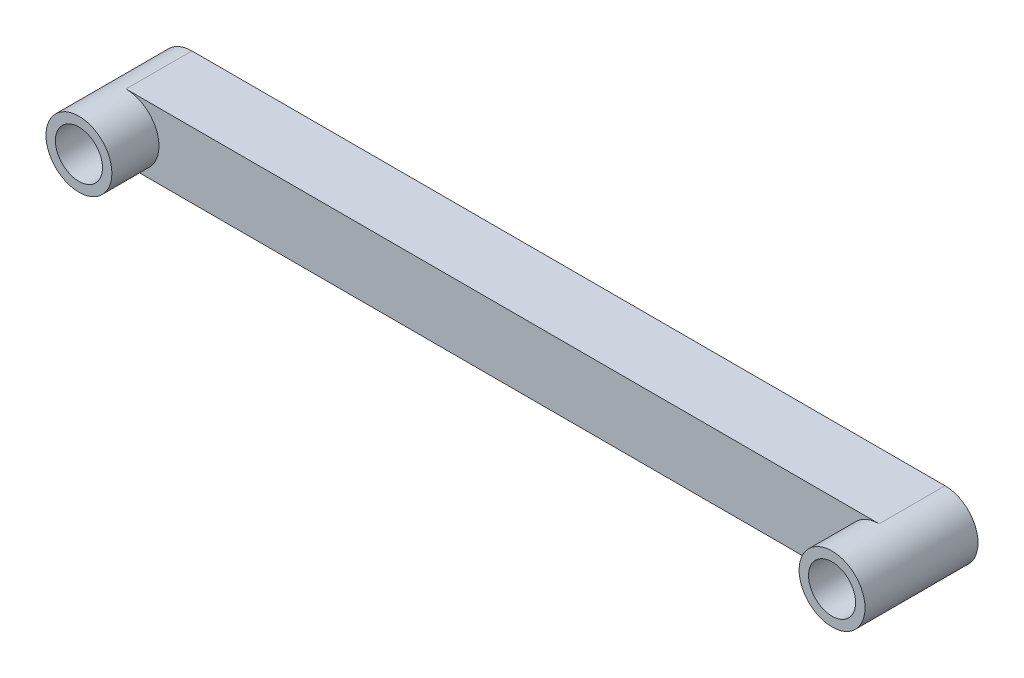
ISO-10303-21;
HEADER;
FILE_DESCRIPTION(('STEP AP214'),'2;1');
FILE_NAME('part.step','',(''),(''),'','','');
FILE_SCHEMA(('AUTOMOTIVE_DESIGN { 1 0 10303 214 1 1 1 1 }'));
ENDSEC;
DATA;
#1=APPLICATION_CONTEXT('core data for automotive mechanical design processes');
#2=APPLICATION_PROTOCOL_DEFINITION('international standard','automotive_design',2000,#1);
#3=PRODUCT_CONTEXT('',#1,'mechanical');
#4=PRODUCT('Part','Part','',(#3));
#5=PRODUCT_RELATED_PRODUCT_CATEGORY('part','',(#4));
#6=PRODUCT_DEFINITION_FORMATION('','',#4);
#7=PRODUCT_DEFINITION_CONTEXT('part definition',#1,'design');
#8=PRODUCT_DEFINITION('design','',#6,#7);
#9=PRODUCT_DEFINITION_SHAPE('','',#8);
#10=(LENGTH_UNIT() NAMED_UNIT(*) SI_UNIT(.MILLI.,.METRE.));
#11=(NAMED_UNIT(*) PLANE_ANGLE_UNIT() SI_UNIT($,.RADIAN.));
#12=(NAMED_UNIT(*) SI_UNIT($,.STERADIAN.) SOLID_ANGLE_UNIT());
#13=UNCERTAINTY_MEASURE_WITH_UNIT(LENGTH_MEASURE(1.E-05),#10,'distance_accuracy_value','');
#14=(GEOMETRIC_REPRESENTATION_CONTEXT(3) GLOBAL_UNCERTAINTY_ASSIGNED_CONTEXT((#13)) GLOBAL_UNIT_ASSIGNED_CONTEXT((#10,
#11,#12)) REPRESENTATION_CONTEXT('',''));
#15=CARTESIAN_POINT('',(0.,0.,0.));
#16=DIRECTION('',(0.,0.,1.));
#17=DIRECTION('',(1.,0.,0.));
#18=AXIS2_PLACEMENT_3D('',#15,#16,#17);
#19=CARTESIAN_POINT('',(-46.5928639082978,0.,14.));
#20=DIRECTION('',(0.,0.,-1.));
#21=DIRECTION('',(-1.,0.,0.));
#22=AXIS2_PLACEMENT_3D('',#19,#20,#21);
#23=CYLINDRICAL_SURFACE('',#22,7.);
#24=CARTESIAN_POINT('',(-46.5928639082978,0.,14.));
#25=DIRECTION('',(0.,0.,1.));
#26=DIRECTION('',(1.,0.,0.));
#27=AXIS2_PLACEMENT_3D('',#24,#25,#26);
#28=CIRCLE('',#27,7.);
#29=CARTESIAN_POINT('',(-39.5928639082978,0.,14.));
#30=VERTEX_POINT('',#29);
#31=EDGE_CURVE('E174',#30,#30,#28,.T.);
#32=ORIENTED_EDGE('',*,*,#31,.F.);
#33=EDGE_LOOP('',(#32));
#34=FACE_BOUND('',#33,.T.);
#35=DIRECTION('',(0.,0.,-1.));
#36=VECTOR('',#35,1.);
#37=CARTESIAN_POINT('',(-46.5928639082978,-7.,4.));
#38=LINE('',#37,#36);
#39=CARTESIAN_POINT('',(-46.5928639082978,-7.,4.));
#40=VERTEX_POINT('',#39);
#41=CARTESIAN_POINT('',(-46.5928639082978,-7.,-10.));
#42=VERTEX_POINT('',#41);
#43=EDGE_CURVE('E98',#40,#42,#38,.T.);
#44=ORIENTED_EDGE('',*,*,#43,.F.);
#45=CARTESIAN_POINT('',(-46.5928639082978,0.,4.));
#46=DIRECTION('',(0.,0.,1.));
#47=DIRECTION('',(1.,0.,0.));
#48=AXIS2_PLACEMENT_3D('',#45,#46,#47);
#49=CIRCLE('',#48,7.);
#50=CARTESIAN_POINT('',(-46.5928639082978,7.,4.));
#51=VERTEX_POINT('',#50);
#52=EDGE_CURVE('E93',#40,#51,#49,.T.);
#53=ORIENTED_EDGE('',*,*,#52,.T.);
#54=DIRECTION('',(0.,0.,-1.));
#55=VECTOR('',#54,1.);
#56=CARTESIAN_POINT('',(-46.5928639082978,7.,4.));
#57=LINE('',#56,#55);
#58=CARTESIAN_POINT('',(-46.5928639082978,7.,-10.));
#59=VERTEX_POINT('',#58);
#60=EDGE_CURVE('E115',#51,#59,#57,.T.);
#61=ORIENTED_EDGE('',*,*,#60,.T.);
#62=CARTESIAN_POINT('',(-46.5928639082978,0.,-10.));
#63=DIRECTION('',(0.,0.,-1.));
#64=DIRECTION('',(-1.,0.,0.));
#65=AXIS2_PLACEMENT_3D('',#62,#63,#64);
#66=CIRCLE('',#65,7.);
#67=EDGE_CURVE('E118',#42,#59,#66,.T.);
#68=ORIENTED_EDGE('',*,*,#67,.F.);
#69=EDGE_LOOP('',(#44,#53,#61,#68));
#70=FACE_BOUND('',#69,.T.);
#71=ADVANCED_FACE('F77',(#34,#70),#23,.T.);
#72=CARTESIAN_POINT('',(0.,0.,4.));
#73=DIRECTION('',(0.,0.,1.));
#74=DIRECTION('',(1.,0.,0.));
#75=AXIS2_PLACEMENT_3D('',#72,#73,#74);
#76=PLANE('',#75);
#77=CARTESIAN_POINT('',(-46.5928639082978,0.,4.));
#78=DIRECTION('',(0.,0.,1.));
#79=DIRECTION('',(1.,0.,0.));
#80=AXIS2_PLACEMENT_3D('',#77,#78,#79);
#81=CIRCLE('',#80,5.);
#82=CARTESIAN_POINT('',(-41.5928639082978,0.,4.));
#83=VERTEX_POINT('',#82);
#84=EDGE_CURVE('E86',#83,#83,#81,.F.);
#85=ORIENTED_EDGE('',*,*,#84,.F.);
#86=EDGE_LOOP('',(#85));
#87=FACE_BOUND('',#86,.T.);
#88=ADVANCED_FACE('F79',(#87),#76,.T.);
#89=CARTESIAN_POINT('',(-46.5928639082978,0.,14.));
#90=DIRECTION('',(0.,0.,-1.));
#91=DIRECTION('',(-1.,0.,0.));
#92=AXIS2_PLACEMENT_3D('',#89,#90,#91);
#93=CYLINDRICAL_SURFACE('',#92,5.);
#94=ORIENTED_EDGE('',*,*,#84,.T.);
#95=EDGE_LOOP('',(#94));
#96=FACE_BOUND('',#95,.T.);
#97=CARTESIAN_POINT('',(-46.5928639082978,0.,14.));
#98=DIRECTION('',(0.,0.,1.));
#99=DIRECTION('',(1.,0.,0.));
#100=AXIS2_PLACEMENT_3D('',#97,#98,#99);
#101=CIRCLE('',#100,5.);
#102=CARTESIAN_POINT('',(-41.5928639082978,0.,14.));
#103=VERTEX_POINT('',#102);
#104=EDGE_CURVE('E178',#103,#103,#101,.T.);
#105=ORIENTED_EDGE('',*,*,#104,.T.);
#106=EDGE_LOOP('',(#105));
#107=FACE_BOUND('',#106,.T.);
#108=ADVANCED_FACE('F185',(#96,#107),#93,.F.);
#109=CARTESIAN_POINT('',(0.,0.,14.));
#110=DIRECTION('',(0.,0.,1.));
#111=DIRECTION('',(1.,0.,0.));
#112=AXIS2_PLACEMENT_3D('',#109,#110,#111);
#113=PLANE('',#112);
#114=ORIENTED_EDGE('',*,*,#31,.T.);
#115=EDGE_LOOP('',(#114));
#116=FACE_BOUND('',#115,.T.);
#117=ORIENTED_EDGE('',*,*,#104,.F.);
#118=EDGE_LOOP('',(#117));
#119=FACE_BOUND('',#118,.T.);
#120=ADVANCED_FACE('F192',(#116,#119),#113,.T.);
#121=CARTESIAN_POINT('',(0.,-7.,4.));
#122=DIRECTION('',(0.,1.,0.));
#123=DIRECTION('',(0.,0.,1.));
#124=AXIS2_PLACEMENT_3D('',#121,#122,#123);
#125=PLANE('',#124);
#126=ORIENTED_EDGE('',*,*,#43,.T.);
#127=DIRECTION('',(-1.,0.,0.));
#128=VECTOR('',#127,1.);
#129=CARTESIAN_POINT('',(113.407136091702,-7.,-10.));
#130=LINE('',#129,#128);
#131=CARTESIAN_POINT('',(113.407136091702,-7.,-10.));
#132=VERTEX_POINT('',#131);
#133=EDGE_CURVE('E139',#132,#42,#130,.T.);
#134=ORIENTED_EDGE('',*,*,#133,.F.);
#135=DIRECTION('',(0.,0.,-1.));
#136=VECTOR('',#135,1.);
#137=CARTESIAN_POINT('',(113.407136091702,-7.,4.));
#138=LINE('',#137,#136);
#139=CARTESIAN_POINT('',(113.407136091702,-7.,4.));
#140=VERTEX_POINT('',#139);
#141=EDGE_CURVE('E169',#140,#132,#138,.T.);
#142=ORIENTED_EDGE('',*,*,#141,.F.);
#143=DIRECTION('',(1.,0.,0.));
#144=VECTOR('',#143,1.);
#145=CARTESIAN_POINT('',(0.,-7.,4.));
#146=LINE('',#145,#144);
#147=EDGE_CURVE('E157',#40,#140,#146,.T.);
#148=ORIENTED_EDGE('',*,*,#147,.F.);
#149=EDGE_LOOP('',(#126,#134,#142,#148));
#150=FACE_BOUND('',#149,.T.);
#151=ADVANCED_FACE('F204',(#150),#125,.F.);
#152=CARTESIAN_POINT('',(0.,7.,4.));
#153=DIRECTION('',(0.,1.,0.));
#154=DIRECTION('',(0.,0.,1.));
#155=AXIS2_PLACEMENT_3D('',#152,#153,#154);
#156=PLANE('',#155);
#157=DIRECTION('',(0.,0.,-1.));
#158=VECTOR('',#157,1.);
#159=CARTESIAN_POINT('',(113.407136091702,7.,4.));
#160=LINE('',#159,#158);
#161=CARTESIAN_POINT('',(113.407136091702,7.,4.));
#162=VERTEX_POINT('',#161);
#163=CARTESIAN_POINT('',(113.407136091702,7.,-10.));
#164=VERTEX_POINT('',#163);
#165=EDGE_CURVE('E123',#162,#164,#160,.T.);
#166=ORIENTED_EDGE('',*,*,#165,.T.);
#167=DIRECTION('',(1.,0.,0.));
#168=VECTOR('',#167,1.);
#169=CARTESIAN_POINT('',(-46.5928639082978,7.,-10.));
#170=LINE('',#169,#168);
#171=EDGE_CURVE('E127',#59,#164,#170,.T.);
#172=ORIENTED_EDGE('',*,*,#171,.F.);
#173=ORIENTED_EDGE('',*,*,#60,.F.);
#174=DIRECTION('',(1.,0.,0.));
#175=VECTOR('',#174,1.);
#176=CARTESIAN_POINT('',(0.,7.,4.));
#177=LINE('',#176,#175);
#178=EDGE_CURVE('E124',#51,#162,#177,.T.);
#179=ORIENTED_EDGE('',*,*,#178,.T.);
#180=EDGE_LOOP('',(#166,#172,#173,#179));
#181=FACE_BOUND('',#180,.T.);
#182=ADVANCED_FACE('F128',(#181),#156,.T.);
#183=CARTESIAN_POINT('',(0.,0.,4.));
#184=DIRECTION('',(0.,0.,1.));
#185=DIRECTION('',(1.,0.,0.));
#186=AXIS2_PLACEMENT_3D('',#183,#184,#185);
#187=PLANE('',#186);
#188=ORIENTED_EDGE('',*,*,#52,.F.);
#189=ORIENTED_EDGE('',*,*,#147,.T.);
#190=CARTESIAN_POINT('',(113.407136091702,0.,4.));
#191=DIRECTION('',(0.,0.,1.));
#192=DIRECTION('',(1.,0.,0.));
#193=AXIS2_PLACEMENT_3D('',#190,#191,#192);
#194=CIRCLE('',#193,7.);
#195=EDGE_CURVE('E161',#162,#140,#194,.T.);
#196=ORIENTED_EDGE('',*,*,#195,.F.);
#197=ORIENTED_EDGE('',*,*,#178,.F.);
#198=EDGE_LOOP('',(#188,#189,#196,#197));
#199=FACE_BOUND('',#198,.T.);
#200=ADVANCED_FACE('F210',(#199),#187,.T.);
#201=CARTESIAN_POINT('',(113.407136091702,0.,14.));
#202=DIRECTION('',(0.,0.,-1.));
#203=DIRECTION('',(-1.,0.,0.));
#204=AXIS2_PLACEMENT_3D('',#201,#202,#203);
#205=CYLINDRICAL_SURFACE('',#204,5.);
#206=CARTESIAN_POINT('',(113.407136091702,0.,4.));
#207=DIRECTION('',(0.,0.,1.));
#208=DIRECTION('',(1.,0.,0.));
#209=AXIS2_PLACEMENT_3D('',#206,#207,#208);
#210=CIRCLE('',#209,5.);
#211=CARTESIAN_POINT('',(118.407136091702,0.,4.));
#212=VERTEX_POINT('',#211);
#213=EDGE_CURVE('E12',#212,#212,#210,.T.);
#214=ORIENTED_EDGE('',*,*,#213,.F.);
#215=EDGE_LOOP('',(#214));
#216=FACE_BOUND('',#215,.T.);
#217=CARTESIAN_POINT('',(113.407136091702,0.,14.));
#218=DIRECTION('',(0.,0.,1.));
#219=DIRECTION('',(1.,0.,0.));
#220=AXIS2_PLACEMENT_3D('',#217,#218,#219);
#221=CIRCLE('',#220,5.);
#222=CARTESIAN_POINT('',(118.407136091702,0.,14.));
#223=VERTEX_POINT('',#222);
#224=EDGE_CURVE('E147',#223,#223,#221,.T.);
#225=ORIENTED_EDGE('',*,*,#224,.T.);
#226=EDGE_LOOP('',(#225));
#227=FACE_BOUND('',#226,.T.);
#228=ADVANCED_FACE('F213',(#216,#227),#205,.F.);
#229=CARTESIAN_POINT('',(113.407136091702,0.,14.));
#230=DIRECTION('',(0.,0.,-1.));
#231=DIRECTION('',(-1.,0.,0.));
#232=AXIS2_PLACEMENT_3D('',#229,#230,#231);
#233=CYLINDRICAL_SURFACE('',#232,7.);
#234=ORIENTED_EDGE('',*,*,#141,.T.);
#235=CARTESIAN_POINT('',(113.407136091702,0.,-10.));
#236=DIRECTION('',(0.,0.,-1.));
#237=DIRECTION('',(-1.,0.,0.));
#238=AXIS2_PLACEMENT_3D('',#235,#236,#237);
#239=CIRCLE('',#238,7.);
#240=EDGE_CURVE('E134',#164,#132,#239,.T.);
#241=ORIENTED_EDGE('',*,*,#240,.F.);
#242=ORIENTED_EDGE('',*,*,#165,.F.);
#243=ORIENTED_EDGE('',*,*,#195,.T.);
#244=EDGE_LOOP('',(#234,#241,#242,#243));
#245=FACE_BOUND('',#244,.T.);
#246=CARTESIAN_POINT('',(113.407136091702,0.,14.));
#247=DIRECTION('',(0.,0.,1.));
#248=DIRECTION('',(1.,0.,0.));
#249=AXIS2_PLACEMENT_3D('',#246,#247,#248);
#250=CIRCLE('',#249,7.);
#251=CARTESIAN_POINT('',(120.407136091702,0.,14.));
#252=VERTEX_POINT('',#251);
#253=EDGE_CURVE('E151',#252,#252,#250,.T.);
#254=ORIENTED_EDGE('',*,*,#253,.F.);
#255=EDGE_LOOP('',(#254));
#256=FACE_BOUND('',#255,.T.);
#257=ADVANCED_FACE('F217',(#245,#256),#233,.T.);
#258=CARTESIAN_POINT('',(0.,0.,14.));
#259=DIRECTION('',(0.,0.,1.));
#260=DIRECTION('',(1.,0.,0.));
#261=AXIS2_PLACEMENT_3D('',#258,#259,#260);
#262=PLANE('',#261);
#263=ORIENTED_EDGE('',*,*,#224,.F.);
#264=EDGE_LOOP('',(#263));
#265=FACE_BOUND('',#264,.T.);
#266=ORIENTED_EDGE('',*,*,#253,.T.);
#267=EDGE_LOOP('',(#266));
#268=FACE_BOUND('',#267,.T.);
#269=ADVANCED_FACE('F221',(#265,#268),#262,.T.);
#270=CARTESIAN_POINT('',(0.,0.,4.));
#271=DIRECTION('',(0.,0.,1.));
#272=DIRECTION('',(1.,0.,0.));
#273=AXIS2_PLACEMENT_3D('',#270,#271,#272);
#274=PLANE('',#273);
#275=ORIENTED_EDGE('',*,*,#213,.T.);
#276=EDGE_LOOP('',(#275));
#277=FACE_BOUND('',#276,.T.);
#278=ADVANCED_FACE('F225',(#277),#274,.T.);
#279=CARTESIAN_POINT('',(-46.5928639082978,0.,-10.));
#280=DIRECTION('',(0.,0.,-1.));
#281=DIRECTION('',(-1.,0.,0.));
#282=AXIS2_PLACEMENT_3D('',#279,#280,#281);
#283=PLANE('',#282);
#284=ORIENTED_EDGE('',*,*,#67,.T.);
#285=ORIENTED_EDGE('',*,*,#171,.T.);
#286=ORIENTED_EDGE('',*,*,#240,.T.);
#287=ORIENTED_EDGE('',*,*,#133,.T.);
#288=EDGE_LOOP('',(#284,#285,#286,#287));
#289=FACE_BOUND('',#288,.T.);
#290=ADVANCED_FACE('F137',(#289),#283,.T.);
#291=CLOSED_SHELL('',(#71,#88,#108,#120,#151,#182,#200,#228,#257,#269,#278,#290));
#292=MANIFOLD_SOLID_BREP('B2',#291);
#293=ADVANCED_BREP_SHAPE_REPRESENTATION('',(#18,#292),#14);
#294=SHAPE_DEFINITION_REPRESENTATION(#9,#293);
ENDSEC;
END-ISO-10303-21;
